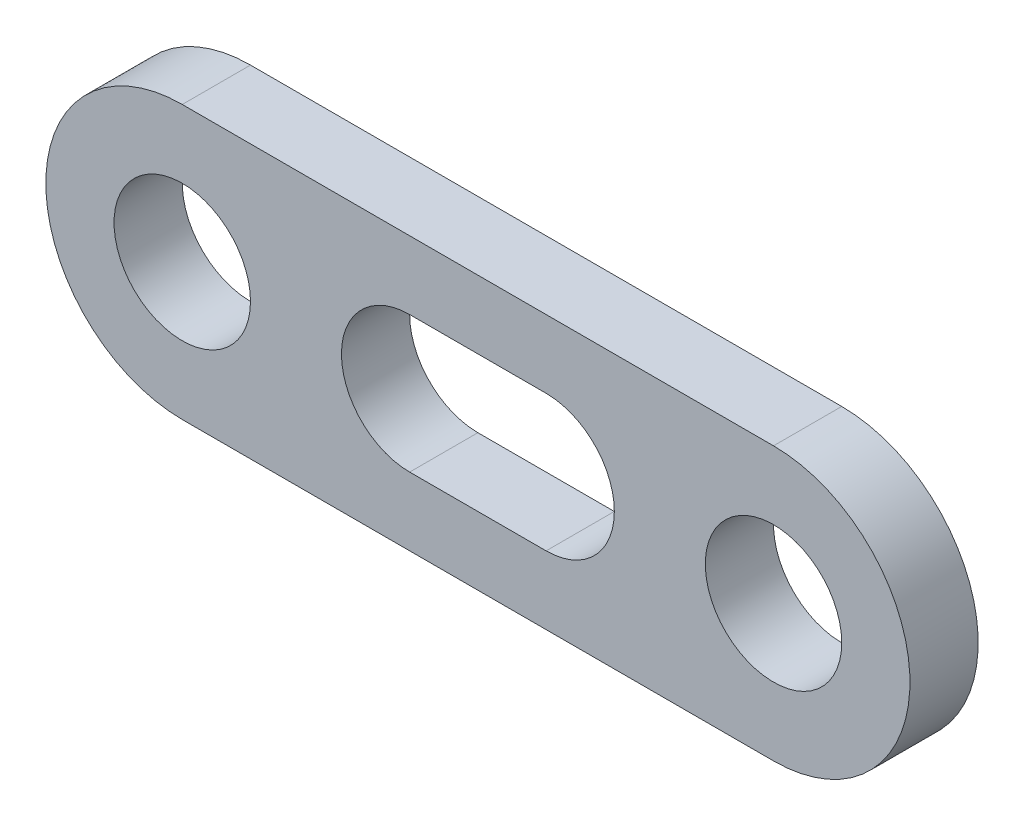
ISO-10303-21;
HEADER;
FILE_DESCRIPTION(('STEP AP214'),'2;1');
FILE_NAME('part.step','',(''),(''),'','','');
FILE_SCHEMA(('AUTOMOTIVE_DESIGN { 1 0 10303 214 1 1 1 1 }'));
ENDSEC;
DATA;
#1=APPLICATION_CONTEXT('core data for automotive mechanical design processes');
#2=APPLICATION_PROTOCOL_DEFINITION('international standard','automotive_design',2000,#1);
#3=PRODUCT_CONTEXT('',#1,'mechanical');
#4=PRODUCT('Part','Part','',(#3));
#5=PRODUCT_RELATED_PRODUCT_CATEGORY('part','',(#4));
#6=PRODUCT_DEFINITION_FORMATION('','',#4);
#7=PRODUCT_DEFINITION_CONTEXT('part definition',#1,'design');
#8=PRODUCT_DEFINITION('design','',#6,#7);
#9=PRODUCT_DEFINITION_SHAPE('','',#8);
#10=(LENGTH_UNIT() NAMED_UNIT(*) SI_UNIT(.MILLI.,.METRE.));
#11=(NAMED_UNIT(*) PLANE_ANGLE_UNIT() SI_UNIT($,.RADIAN.));
#12=(NAMED_UNIT(*) SI_UNIT($,.STERADIAN.) SOLID_ANGLE_UNIT());
#13=UNCERTAINTY_MEASURE_WITH_UNIT(LENGTH_MEASURE(1.E-05),#10,'distance_accuracy_value','');
#14=(GEOMETRIC_REPRESENTATION_CONTEXT(3) GLOBAL_UNCERTAINTY_ASSIGNED_CONTEXT((#13)) GLOBAL_UNIT_ASSIGNED_CONTEXT((#10,
#11,#12)) REPRESENTATION_CONTEXT('',''));
#15=CARTESIAN_POINT('',(0.,0.,0.));
#16=DIRECTION('',(0.,0.,1.));
#17=DIRECTION('',(1.,0.,0.));
#18=AXIS2_PLACEMENT_3D('',#15,#16,#17);
#19=CARTESIAN_POINT('',(0.,0.,3.));
#20=DIRECTION('',(0.,0.,1.));
#21=DIRECTION('',(1.,0.,0.));
#22=AXIS2_PLACEMENT_3D('',#19,#20,#21);
#23=PLANE('',#22);
#24=CARTESIAN_POINT('',(0.,0.,3.));
#25=DIRECTION('',(0.,0.,1.));
#26=DIRECTION('',(1.,0.,0.));
#27=AXIS2_PLACEMENT_3D('',#24,#25,#26);
#28=CIRCLE('',#27,3.);
#29=CARTESIAN_POINT('',(3.,0.,3.));
#30=VERTEX_POINT('',#29);
#31=EDGE_CURVE('E140',#30,#30,#28,.T.);
#32=ORIENTED_EDGE('',*,*,#31,.F.);
#33=EDGE_LOOP('',(#32));
#34=FACE_BOUND('',#33,.T.);
#35=CARTESIAN_POINT('',(0.,0.,3.));
#36=DIRECTION('',(0.,0.,1.));
#37=DIRECTION('',(1.,0.,0.));
#38=AXIS2_PLACEMENT_3D('',#35,#36,#37);
#39=CIRCLE('',#38,6.);
#40=CARTESIAN_POINT('',(0.,6.,3.));
#41=VERTEX_POINT('',#40);
#42=CARTESIAN_POINT('',(0.,-6.,3.));
#43=VERTEX_POINT('',#42);
#44=EDGE_CURVE('E146',#41,#43,#39,.T.);
#45=ORIENTED_EDGE('',*,*,#44,.T.);
#46=DIRECTION('',(1.,0.,0.));
#47=VECTOR('',#46,1.);
#48=CARTESIAN_POINT('',(0.,-6.,3.));
#49=LINE('',#48,#47);
#50=CARTESIAN_POINT('',(26.,-6.,3.));
#51=VERTEX_POINT('',#50);
#52=EDGE_CURVE('E149',#43,#51,#49,.T.);
#53=ORIENTED_EDGE('',*,*,#52,.T.);
#54=CARTESIAN_POINT('',(26.,0.,3.));
#55=DIRECTION('',(0.,0.,1.));
#56=DIRECTION('',(1.,0.,0.));
#57=AXIS2_PLACEMENT_3D('',#54,#55,#56);
#58=CIRCLE('',#57,6.);
#59=CARTESIAN_POINT('',(26.,6.,3.));
#60=VERTEX_POINT('',#59);
#61=EDGE_CURVE('E152',#51,#60,#58,.T.);
#62=ORIENTED_EDGE('',*,*,#61,.T.);
#63=DIRECTION('',(-1.,0.,0.));
#64=VECTOR('',#63,1.);
#65=CARTESIAN_POINT('',(0.,6.,3.));
#66=LINE('',#65,#64);
#67=EDGE_CURVE('E154',#60,#41,#66,.T.);
#68=ORIENTED_EDGE('',*,*,#67,.T.);
#69=EDGE_LOOP('',(#45,#53,#62,#68));
#70=FACE_BOUND('',#69,.T.);
#71=CARTESIAN_POINT('',(26.,0.,3.));
#72=DIRECTION('',(0.,0.,1.));
#73=DIRECTION('',(1.,0.,0.));
#74=AXIS2_PLACEMENT_3D('',#71,#72,#73);
#75=CIRCLE('',#74,3.);
#76=CARTESIAN_POINT('',(29.,0.,3.));
#77=VERTEX_POINT('',#76);
#78=EDGE_CURVE('E134',#77,#77,#75,.T.);
#79=ORIENTED_EDGE('',*,*,#78,.F.);
#80=EDGE_LOOP('',(#79));
#81=FACE_BOUND('',#80,.T.);
#82=DIRECTION('',(1.,0.,0.));
#83=VECTOR('',#82,1.);
#84=CARTESIAN_POINT('',(10.,-3.,3.));
#85=LINE('',#84,#83);
#86=CARTESIAN_POINT('',(10.,-3.,3.));
#87=VERTEX_POINT('',#86);
#88=CARTESIAN_POINT('',(16.,-2.99999999999999,3.));
#89=VERTEX_POINT('',#88);
#90=EDGE_CURVE('E106',#87,#89,#85,.T.);
#91=ORIENTED_EDGE('',*,*,#90,.F.);
#92=CARTESIAN_POINT('',(10.,0.,3.));
#93=DIRECTION('',(0.,0.,1.));
#94=DIRECTION('',(1.,0.,0.));
#95=AXIS2_PLACEMENT_3D('',#92,#93,#94);
#96=CIRCLE('',#95,3.);
#97=CARTESIAN_POINT('',(10.,3.,3.));
#98=VERTEX_POINT('',#97);
#99=EDGE_CURVE('E98',#98,#87,#96,.T.);
#100=ORIENTED_EDGE('',*,*,#99,.F.);
#101=DIRECTION('',(-1.,0.,0.));
#102=VECTOR('',#101,1.);
#103=CARTESIAN_POINT('',(10.,3.,3.));
#104=LINE('',#103,#102);
#105=CARTESIAN_POINT('',(16.,2.99999999999999,3.));
#106=VERTEX_POINT('',#105);
#107=EDGE_CURVE('E120',#106,#98,#104,.T.);
#108=ORIENTED_EDGE('',*,*,#107,.F.);
#109=CARTESIAN_POINT('',(16.,0.,3.));
#110=DIRECTION('',(0.,0.,1.));
#111=DIRECTION('',(1.,0.,0.));
#112=AXIS2_PLACEMENT_3D('',#109,#110,#111);
#113=CIRCLE('',#112,2.99999999999999);
#114=EDGE_CURVE('E118',#89,#106,#113,.T.);
#115=ORIENTED_EDGE('',*,*,#114,.F.);
#116=EDGE_LOOP('',(#91,#100,#108,#115));
#117=FACE_BOUND('',#116,.T.);
#118=ADVANCED_FACE('F33',(#34,#70,#81,#117),#23,.T.);
#119=CARTESIAN_POINT('',(0.,0.,0.));
#120=DIRECTION('',(0.,0.,1.));
#121=DIRECTION('',(1.,0.,0.));
#122=AXIS2_PLACEMENT_3D('',#119,#120,#121);
#123=PLANE('',#122);
#124=CARTESIAN_POINT('',(26.,0.,0.));
#125=DIRECTION('',(0.,0.,1.));
#126=DIRECTION('',(1.,0.,0.));
#127=AXIS2_PLACEMENT_3D('',#124,#125,#126);
#128=CIRCLE('',#127,3.);
#129=CARTESIAN_POINT('',(29.,0.,0.));
#130=VERTEX_POINT('',#129);
#131=EDGE_CURVE('E114',#130,#130,#128,.T.);
#132=ORIENTED_EDGE('',*,*,#131,.T.);
#133=EDGE_LOOP('',(#132));
#134=FACE_BOUND('',#133,.T.);
#135=CARTESIAN_POINT('',(0.,0.,0.));
#136=DIRECTION('',(0.,0.,1.));
#137=DIRECTION('',(1.,0.,0.));
#138=AXIS2_PLACEMENT_3D('',#135,#136,#137);
#139=CIRCLE('',#138,3.);
#140=CARTESIAN_POINT('',(3.,0.,0.));
#141=VERTEX_POINT('',#140);
#142=EDGE_CURVE('E137',#141,#141,#139,.T.);
#143=ORIENTED_EDGE('',*,*,#142,.T.);
#144=EDGE_LOOP('',(#143));
#145=FACE_BOUND('',#144,.T.);
#146=CARTESIAN_POINT('',(0.,0.,0.));
#147=DIRECTION('',(0.,0.,1.));
#148=DIRECTION('',(1.,0.,0.));
#149=AXIS2_PLACEMENT_3D('',#146,#147,#148);
#150=CIRCLE('',#149,6.);
#151=CARTESIAN_POINT('',(0.,6.,0.));
#152=VERTEX_POINT('',#151);
#153=CARTESIAN_POINT('',(0.,-6.,0.));
#154=VERTEX_POINT('',#153);
#155=EDGE_CURVE('E143',#152,#154,#150,.T.);
#156=ORIENTED_EDGE('',*,*,#155,.F.);
#157=DIRECTION('',(-1.,0.,0.));
#158=VECTOR('',#157,1.);
#159=CARTESIAN_POINT('',(0.,6.,0.));
#160=LINE('',#159,#158);
#161=CARTESIAN_POINT('',(26.,6.,0.));
#162=VERTEX_POINT('',#161);
#163=EDGE_CURVE('E150',#162,#152,#160,.T.);
#164=ORIENTED_EDGE('',*,*,#163,.F.);
#165=CARTESIAN_POINT('',(26.,0.,0.));
#166=DIRECTION('',(0.,0.,1.));
#167=DIRECTION('',(1.,0.,0.));
#168=AXIS2_PLACEMENT_3D('',#165,#166,#167);
#169=CIRCLE('',#168,6.);
#170=CARTESIAN_POINT('',(26.,-6.,0.));
#171=VERTEX_POINT('',#170);
#172=EDGE_CURVE('E161',#171,#162,#169,.T.);
#173=ORIENTED_EDGE('',*,*,#172,.F.);
#174=DIRECTION('',(1.,0.,0.));
#175=VECTOR('',#174,1.);
#176=CARTESIAN_POINT('',(0.,-6.,0.));
#177=LINE('',#176,#175);
#178=EDGE_CURVE('E159',#154,#171,#177,.T.);
#179=ORIENTED_EDGE('',*,*,#178,.F.);
#180=EDGE_LOOP('',(#156,#164,#173,#179));
#181=FACE_BOUND('',#180,.T.);
#182=CARTESIAN_POINT('',(10.,0.,0.));
#183=DIRECTION('',(0.,0.,1.));
#184=DIRECTION('',(1.,0.,0.));
#185=AXIS2_PLACEMENT_3D('',#182,#183,#184);
#186=CIRCLE('',#185,3.);
#187=CARTESIAN_POINT('',(10.,3.,0.));
#188=VERTEX_POINT('',#187);
#189=CARTESIAN_POINT('',(10.,-3.,0.));
#190=VERTEX_POINT('',#189);
#191=EDGE_CURVE('E56',#188,#190,#186,.T.);
#192=ORIENTED_EDGE('',*,*,#191,.T.);
#193=DIRECTION('',(1.,0.,0.));
#194=VECTOR('',#193,1.);
#195=CARTESIAN_POINT('',(10.,-3.,0.));
#196=LINE('',#195,#194);
#197=CARTESIAN_POINT('',(16.,-2.99999999999999,0.));
#198=VERTEX_POINT('',#197);
#199=EDGE_CURVE('E113',#190,#198,#196,.T.);
#200=ORIENTED_EDGE('',*,*,#199,.T.);
#201=CARTESIAN_POINT('',(16.,0.,0.));
#202=DIRECTION('',(0.,0.,1.));
#203=DIRECTION('',(1.,0.,0.));
#204=AXIS2_PLACEMENT_3D('',#201,#202,#203);
#205=CIRCLE('',#204,2.99999999999999);
#206=CARTESIAN_POINT('',(16.,2.99999999999999,0.));
#207=VERTEX_POINT('',#206);
#208=EDGE_CURVE('E126',#198,#207,#205,.T.);
#209=ORIENTED_EDGE('',*,*,#208,.T.);
#210=DIRECTION('',(-1.,0.,0.));
#211=VECTOR('',#210,1.);
#212=CARTESIAN_POINT('',(10.,3.,0.));
#213=LINE('',#212,#211);
#214=EDGE_CURVE('E107',#207,#188,#213,.T.);
#215=ORIENTED_EDGE('',*,*,#214,.T.);
#216=EDGE_LOOP('',(#192,#200,#209,#215));
#217=FACE_BOUND('',#216,.T.);
#218=ADVANCED_FACE('F179',(#134,#145,#181,#217),#123,.F.);
#219=CARTESIAN_POINT('',(0.,0.,3.));
#220=DIRECTION('',(0.,0.,-1.));
#221=DIRECTION('',(-1.,0.,0.));
#222=AXIS2_PLACEMENT_3D('',#219,#220,#221);
#223=CYLINDRICAL_SURFACE('',#222,6.);
#224=ORIENTED_EDGE('',*,*,#155,.T.);
#225=DIRECTION('',(0.,0.,-1.));
#226=VECTOR('',#225,1.);
#227=CARTESIAN_POINT('',(0.,-6.,3.));
#228=LINE('',#227,#226);
#229=EDGE_CURVE('E11',#43,#154,#228,.T.);
#230=ORIENTED_EDGE('',*,*,#229,.F.);
#231=ORIENTED_EDGE('',*,*,#44,.F.);
#232=DIRECTION('',(0.,0.,-1.));
#233=VECTOR('',#232,1.);
#234=CARTESIAN_POINT('',(0.,6.,3.));
#235=LINE('',#234,#233);
#236=EDGE_CURVE('E156',#41,#152,#235,.T.);
#237=ORIENTED_EDGE('',*,*,#236,.T.);
#238=EDGE_LOOP('',(#224,#230,#231,#237));
#239=FACE_BOUND('',#238,.T.);
#240=ADVANCED_FACE('F35',(#239),#223,.T.);
#241=CARTESIAN_POINT('',(0.,-6.,3.));
#242=DIRECTION('',(0.,1.,0.));
#243=DIRECTION('',(-1.,0.,0.));
#244=AXIS2_PLACEMENT_3D('',#241,#242,#243);
#245=PLANE('',#244);
#246=ORIENTED_EDGE('',*,*,#178,.T.);
#247=DIRECTION('',(0.,0.,-1.));
#248=VECTOR('',#247,1.);
#249=CARTESIAN_POINT('',(26.,-6.,3.));
#250=LINE('',#249,#248);
#251=EDGE_CURVE('E41',#51,#171,#250,.T.);
#252=ORIENTED_EDGE('',*,*,#251,.F.);
#253=ORIENTED_EDGE('',*,*,#52,.F.);
#254=ORIENTED_EDGE('',*,*,#229,.T.);
#255=EDGE_LOOP('',(#246,#252,#253,#254));
#256=FACE_BOUND('',#255,.T.);
#257=ADVANCED_FACE('F190',(#256),#245,.F.);
#258=CARTESIAN_POINT('',(26.,0.,3.));
#259=DIRECTION('',(0.,0.,-1.));
#260=DIRECTION('',(-1.,0.,0.));
#261=AXIS2_PLACEMENT_3D('',#258,#259,#260);
#262=CYLINDRICAL_SURFACE('',#261,6.);
#263=ORIENTED_EDGE('',*,*,#172,.T.);
#264=DIRECTION('',(0.,0.,-1.));
#265=VECTOR('',#264,1.);
#266=CARTESIAN_POINT('',(26.,6.,3.));
#267=LINE('',#266,#265);
#268=EDGE_CURVE('E166',#60,#162,#267,.T.);
#269=ORIENTED_EDGE('',*,*,#268,.F.);
#270=ORIENTED_EDGE('',*,*,#61,.F.);
#271=ORIENTED_EDGE('',*,*,#251,.T.);
#272=EDGE_LOOP('',(#263,#269,#270,#271));
#273=FACE_BOUND('',#272,.T.);
#274=ADVANCED_FACE('F173',(#273),#262,.T.);
#275=CARTESIAN_POINT('',(0.,6.,3.));
#276=DIRECTION('',(0.,-1.,0.));
#277=DIRECTION('',(1.,0.,0.));
#278=AXIS2_PLACEMENT_3D('',#275,#276,#277);
#279=PLANE('',#278);
#280=ORIENTED_EDGE('',*,*,#163,.T.);
#281=ORIENTED_EDGE('',*,*,#236,.F.);
#282=ORIENTED_EDGE('',*,*,#67,.F.);
#283=ORIENTED_EDGE('',*,*,#268,.T.);
#284=EDGE_LOOP('',(#280,#281,#282,#283));
#285=FACE_BOUND('',#284,.T.);
#286=ADVANCED_FACE('F183',(#285),#279,.F.);
#287=CARTESIAN_POINT('',(0.,0.,3.));
#288=DIRECTION('',(0.,0.,-1.));
#289=DIRECTION('',(-1.,0.,0.));
#290=AXIS2_PLACEMENT_3D('',#287,#288,#289);
#291=CYLINDRICAL_SURFACE('',#290,3.);
#292=ORIENTED_EDGE('',*,*,#31,.T.);
#293=EDGE_LOOP('',(#292));
#294=FACE_BOUND('',#293,.T.);
#295=ORIENTED_EDGE('',*,*,#142,.F.);
#296=EDGE_LOOP('',(#295));
#297=FACE_BOUND('',#296,.T.);
#298=ADVANCED_FACE('F207',(#294,#297),#291,.F.);
#299=CARTESIAN_POINT('',(26.,0.,3.));
#300=DIRECTION('',(0.,0.,-1.));
#301=DIRECTION('',(-1.,0.,0.));
#302=AXIS2_PLACEMENT_3D('',#299,#300,#301);
#303=CYLINDRICAL_SURFACE('',#302,3.);
#304=ORIENTED_EDGE('',*,*,#78,.T.);
#305=EDGE_LOOP('',(#304));
#306=FACE_BOUND('',#305,.T.);
#307=ORIENTED_EDGE('',*,*,#131,.F.);
#308=EDGE_LOOP('',(#307));
#309=FACE_BOUND('',#308,.T.);
#310=ADVANCED_FACE('F214',(#306,#309),#303,.F.);
#311=CARTESIAN_POINT('',(10.,0.,3.));
#312=DIRECTION('',(0.,0.,-1.));
#313=DIRECTION('',(-1.,0.,0.));
#314=AXIS2_PLACEMENT_3D('',#311,#312,#313);
#315=CYLINDRICAL_SURFACE('',#314,3.);
#316=ORIENTED_EDGE('',*,*,#191,.F.);
#317=DIRECTION('',(0.,0.,-1.));
#318=VECTOR('',#317,1.);
#319=CARTESIAN_POINT('',(10.,3.,3.));
#320=LINE('',#319,#318);
#321=EDGE_CURVE('E102',#98,#188,#320,.T.);
#322=ORIENTED_EDGE('',*,*,#321,.F.);
#323=ORIENTED_EDGE('',*,*,#99,.T.);
#324=DIRECTION('',(0.,0.,-1.));
#325=VECTOR('',#324,1.);
#326=CARTESIAN_POINT('',(10.,-3.,3.));
#327=LINE('',#326,#325);
#328=EDGE_CURVE('E101',#87,#190,#327,.T.);
#329=ORIENTED_EDGE('',*,*,#328,.T.);
#330=EDGE_LOOP('',(#316,#322,#323,#329));
#331=FACE_BOUND('',#330,.T.);
#332=ADVANCED_FACE('F100',(#331),#315,.F.);
#333=CARTESIAN_POINT('',(10.,-3.,3.));
#334=DIRECTION('',(0.,1.,0.));
#335=DIRECTION('',(-1.,0.,0.));
#336=AXIS2_PLACEMENT_3D('',#333,#334,#335);
#337=PLANE('',#336);
#338=ORIENTED_EDGE('',*,*,#199,.F.);
#339=ORIENTED_EDGE('',*,*,#328,.F.);
#340=ORIENTED_EDGE('',*,*,#90,.T.);
#341=DIRECTION('',(0.,0.,-1.));
#342=VECTOR('',#341,1.);
#343=CARTESIAN_POINT('',(16.,-2.99999999999999,3.));
#344=LINE('',#343,#342);
#345=EDGE_CURVE('E115',#89,#198,#344,.T.);
#346=ORIENTED_EDGE('',*,*,#345,.T.);
#347=EDGE_LOOP('',(#338,#339,#340,#346));
#348=FACE_BOUND('',#347,.T.);
#349=ADVANCED_FACE('F110',(#348),#337,.T.);
#350=CARTESIAN_POINT('',(16.,0.,3.));
#351=DIRECTION('',(0.,0.,-1.));
#352=DIRECTION('',(-1.,0.,0.));
#353=AXIS2_PLACEMENT_3D('',#350,#351,#352);
#354=CYLINDRICAL_SURFACE('',#353,2.99999999999999);
#355=ORIENTED_EDGE('',*,*,#208,.F.);
#356=ORIENTED_EDGE('',*,*,#345,.F.);
#357=ORIENTED_EDGE('',*,*,#114,.T.);
#358=DIRECTION('',(0.,0.,-1.));
#359=VECTOR('',#358,1.);
#360=CARTESIAN_POINT('',(16.,2.99999999999999,3.));
#361=LINE('',#360,#359);
#362=EDGE_CURVE('E48',#106,#207,#361,.T.);
#363=ORIENTED_EDGE('',*,*,#362,.T.);
#364=EDGE_LOOP('',(#355,#356,#357,#363));
#365=FACE_BOUND('',#364,.T.);
#366=ADVANCED_FACE('F231',(#365),#354,.F.);
#367=CARTESIAN_POINT('',(10.,3.,3.));
#368=DIRECTION('',(0.,-1.,0.));
#369=DIRECTION('',(1.,0.,0.));
#370=AXIS2_PLACEMENT_3D('',#367,#368,#369);
#371=PLANE('',#370);
#372=ORIENTED_EDGE('',*,*,#214,.F.);
#373=ORIENTED_EDGE('',*,*,#362,.F.);
#374=ORIENTED_EDGE('',*,*,#107,.T.);
#375=ORIENTED_EDGE('',*,*,#321,.T.);
#376=EDGE_LOOP('',(#372,#373,#374,#375));
#377=FACE_BOUND('',#376,.T.);
#378=ADVANCED_FACE('F234',(#377),#371,.T.);
#379=CLOSED_SHELL('',(#118,#218,#240,#257,#274,#286,#298,#310,#332,#349,#366,#378));
#380=MANIFOLD_SOLID_BREP('B2',#379);
#381=ADVANCED_BREP_SHAPE_REPRESENTATION('',(#18,#380),#14);
#382=SHAPE_DEFINITION_REPRESENTATION(#9,#381);
ENDSEC;
END-ISO-10303-21;
